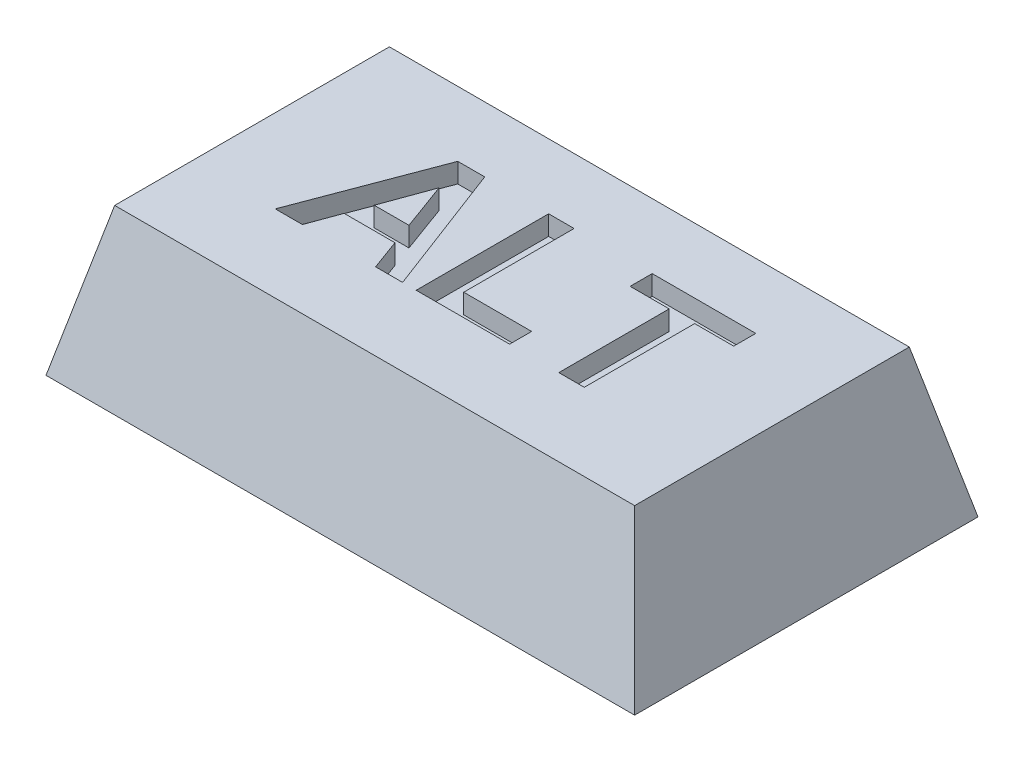
ISO-10303-21;
HEADER;
FILE_DESCRIPTION(('STEP AP214'),'2;1');
FILE_NAME('part.step','',(''),(''),'','','');
FILE_SCHEMA(('AUTOMOTIVE_DESIGN { 1 0 10303 214 1 1 1 1 }'));
ENDSEC;
DATA;
#1=APPLICATION_CONTEXT('core data for automotive mechanical design processes');
#2=APPLICATION_PROTOCOL_DEFINITION('international standard','automotive_design',2000,#1);
#3=PRODUCT_CONTEXT('',#1,'mechanical');
#4=PRODUCT('Part','Part','',(#3));
#5=PRODUCT_RELATED_PRODUCT_CATEGORY('part','',(#4));
#6=PRODUCT_DEFINITION_FORMATION('','',#4);
#7=PRODUCT_DEFINITION_CONTEXT('part definition',#1,'design');
#8=PRODUCT_DEFINITION('design','',#6,#7);
#9=PRODUCT_DEFINITION_SHAPE('','',#8);
#10=(LENGTH_UNIT() NAMED_UNIT(*) SI_UNIT(.MILLI.,.METRE.));
#11=(NAMED_UNIT(*) PLANE_ANGLE_UNIT() SI_UNIT($,.RADIAN.));
#12=(NAMED_UNIT(*) SI_UNIT($,.STERADIAN.) SOLID_ANGLE_UNIT());
#13=UNCERTAINTY_MEASURE_WITH_UNIT(LENGTH_MEASURE(1.E-05),#10,'distance_accuracy_value','');
#14=(GEOMETRIC_REPRESENTATION_CONTEXT(3) GLOBAL_UNCERTAINTY_ASSIGNED_CONTEXT((#13)) GLOBAL_UNIT_ASSIGNED_CONTEXT((#10,
#11,#12)) REPRESENTATION_CONTEXT('',''));
#15=CARTESIAN_POINT('',(0.,0.,0.));
#16=DIRECTION('',(0.,0.,1.));
#17=DIRECTION('',(1.,0.,0.));
#18=AXIS2_PLACEMENT_3D('',#15,#16,#17);
#19=CARTESIAN_POINT('',(0.,3.,0.));
#20=DIRECTION('',(0.,-1.,0.));
#21=DIRECTION('',(0.,0.,-1.));
#22=AXIS2_PLACEMENT_3D('',#19,#20,#21);
#23=PLANE('',#22);
#24=DIRECTION('',(-1.,0.,0.));
#25=VECTOR('',#24,1.);
#26=CARTESIAN_POINT('',(7.17505002507356,3.,-2.27554803448293));
#27=LINE('',#26,#25);
#28=CARTESIAN_POINT('',(7.17505002507356,3.,-2.27554803448293));
#29=VERTEX_POINT('',#28);
#30=CARTESIAN_POINT('',(5.27120387122741,3.,-2.27554803448293));
#31=VERTEX_POINT('',#30);
#32=EDGE_CURVE('E274',#29,#31,#27,.T.);
#33=ORIENTED_EDGE('',*,*,#32,.T.);
#34=DIRECTION('',(0.,0.,-1.));
#35=VECTOR('',#34,1.);
#36=CARTESIAN_POINT('',(5.27120387122741,3.,-2.27554803448293));
#37=LINE('',#36,#35);
#38=CARTESIAN_POINT('',(5.27120387122741,3.,-4.97554803448293));
#39=VERTEX_POINT('',#38);
#40=EDGE_CURVE('E400',#31,#39,#37,.T.);
#41=ORIENTED_EDGE('',*,*,#40,.T.);
#42=DIRECTION('',(1.,0.,0.));
#43=VECTOR('',#42,1.);
#44=CARTESIAN_POINT('',(5.27120387122741,3.,-4.97554803448293));
#45=LINE('',#44,#43);
#46=CARTESIAN_POINT('',(5.79043464045818,3.,-4.97554803448293));
#47=VERTEX_POINT('',#46);
#48=EDGE_CURVE('E396',#39,#47,#45,.T.);
#49=ORIENTED_EDGE('',*,*,#48,.T.);
#50=DIRECTION('',(0.,0.,1.));
#51=VECTOR('',#50,1.);
#52=CARTESIAN_POINT('',(5.79043464045818,3.,-4.97554803448293));
#53=LINE('',#52,#51);
#54=CARTESIAN_POINT('',(5.79043464045818,3.,-2.72554803448293));
#55=VERTEX_POINT('',#54);
#56=EDGE_CURVE('E392',#47,#55,#53,.T.);
#57=ORIENTED_EDGE('',*,*,#56,.T.);
#58=DIRECTION('',(1.,0.,0.));
#59=VECTOR('',#58,1.);
#60=CARTESIAN_POINT('',(5.79043464045818,3.,-2.72554803448293));
#61=LINE('',#60,#59);
#62=CARTESIAN_POINT('',(7.17505002507356,3.,-2.72554803448293));
#63=VERTEX_POINT('',#62);
#64=EDGE_CURVE('E387',#55,#63,#61,.T.);
#65=ORIENTED_EDGE('',*,*,#64,.T.);
#66=DIRECTION('',(0.,0.,1.));
#67=VECTOR('',#66,1.);
#68=CARTESIAN_POINT('',(7.17505002507356,3.,-2.72554803448293));
#69=LINE('',#68,#67);
#70=EDGE_CURVE('E383',#63,#29,#69,.T.);
#71=ORIENTED_EDGE('',*,*,#70,.T.);
#72=EDGE_LOOP('',(#33,#41,#49,#57,#65,#71));
#73=FACE_BOUND('',#72,.T.);
#74=DIRECTION('',(-1.,0.,0.));
#75=VECTOR('',#74,1.);
#76=CARTESIAN_POINT('',(12.,3.,-0.7));
#77=LINE('',#76,#75);
#78=CARTESIAN_POINT('',(11.3,3.,-0.7));
#79=VERTEX_POINT('',#78);
#80=CARTESIAN_POINT('',(0.7,3.,-0.7));
#81=VERTEX_POINT('',#80);
#82=EDGE_CURVE('E514',#79,#81,#77,.T.);
#83=ORIENTED_EDGE('',*,*,#82,.F.);
#84=DIRECTION('',(0.,0.,1.));
#85=VECTOR('',#84,1.);
#86=CARTESIAN_POINT('',(11.3,3.,-7.));
#87=LINE('',#86,#85);
#88=CARTESIAN_POINT('',(11.3,3.,-6.3));
#89=VERTEX_POINT('',#88);
#90=EDGE_CURVE('E526',#89,#79,#87,.T.);
#91=ORIENTED_EDGE('',*,*,#90,.F.);
#92=DIRECTION('',(-1.,0.,0.));
#93=VECTOR('',#92,1.);
#94=CARTESIAN_POINT('',(12.,3.,-6.3));
#95=LINE('',#94,#93);
#96=CARTESIAN_POINT('',(0.700000000000001,3.,-6.3));
#97=VERTEX_POINT('',#96);
#98=EDGE_CURVE('E510',#89,#97,#95,.T.);
#99=ORIENTED_EDGE('',*,*,#98,.T.);
#100=DIRECTION('',(0.,0.,1.));
#101=VECTOR('',#100,1.);
#102=CARTESIAN_POINT('',(0.7,3.,-7.));
#103=LINE('',#102,#101);
#104=EDGE_CURVE('E527',#97,#81,#103,.T.);
#105=ORIENTED_EDGE('',*,*,#104,.T.);
#106=EDGE_LOOP('',(#83,#91,#99,#105));
#107=FACE_BOUND('',#106,.T.);
#108=DIRECTION('',(-1.,0.,0.));
#109=VECTOR('',#108,1.);
#110=CARTESIAN_POINT('',(8.69812694815049,3.,-2.27554803448293));
#111=LINE('',#110,#109);
#112=CARTESIAN_POINT('',(8.69812694815049,3.,-2.27554803448293));
#113=VERTEX_POINT('',#112);
#114=CARTESIAN_POINT('',(8.17889617891972,3.,-2.27554803448293));
#115=VERTEX_POINT('',#114);
#116=EDGE_CURVE('E366',#113,#115,#111,.T.);
#117=ORIENTED_EDGE('',*,*,#116,.T.);
#118=DIRECTION('',(0.,0.,-1.));
#119=VECTOR('',#118,1.);
#120=CARTESIAN_POINT('',(8.17889617891972,3.,-2.27554803448293));
#121=LINE('',#120,#119);
#122=CARTESIAN_POINT('',(8.17889617891972,3.,-4.52554803448293));
#123=VERTEX_POINT('',#122);
#124=EDGE_CURVE('E476',#115,#123,#121,.T.);
#125=ORIENTED_EDGE('',*,*,#124,.T.);
#126=DIRECTION('',(-1.,0.,0.));
#127=VECTOR('',#126,1.);
#128=CARTESIAN_POINT('',(8.17889617891972,3.,-4.52554803448293));
#129=LINE('',#128,#127);
#130=CARTESIAN_POINT('',(7.38274233276587,3.,-4.52554803448293));
#131=VERTEX_POINT('',#130);
#132=EDGE_CURVE('E472',#123,#131,#129,.T.);
#133=ORIENTED_EDGE('',*,*,#132,.T.);
#134=DIRECTION('',(0.,0.,-1.));
#135=VECTOR('',#134,1.);
#136=CARTESIAN_POINT('',(7.38274233276587,3.,-4.52554803448293));
#137=LINE('',#136,#135);
#138=CARTESIAN_POINT('',(7.38274233276587,3.,-4.97554803448293));
#139=VERTEX_POINT('',#138);
#140=EDGE_CURVE('E468',#131,#139,#137,.T.);
#141=ORIENTED_EDGE('',*,*,#140,.T.);
#142=DIRECTION('',(1.,0.,0.));
#143=VECTOR('',#142,1.);
#144=CARTESIAN_POINT('',(7.38274233276587,3.,-4.97554803448293));
#145=LINE('',#144,#143);
#146=CARTESIAN_POINT('',(9.49428079430433,3.,-4.97554803448293));
#147=VERTEX_POINT('',#146);
#148=EDGE_CURVE('E464',#139,#147,#145,.T.);
#149=ORIENTED_EDGE('',*,*,#148,.T.);
#150=DIRECTION('',(0.,0.,1.));
#151=VECTOR('',#150,1.);
#152=CARTESIAN_POINT('',(9.49428079430433,3.,-4.97554803448293));
#153=LINE('',#152,#151);
#154=CARTESIAN_POINT('',(9.49428079430433,3.,-4.52554803448293));
#155=VERTEX_POINT('',#154);
#156=EDGE_CURVE('E460',#147,#155,#153,.T.);
#157=ORIENTED_EDGE('',*,*,#156,.T.);
#158=DIRECTION('',(-1.,0.,0.));
#159=VECTOR('',#158,1.);
#160=CARTESIAN_POINT('',(9.49428079430433,3.,-4.52554803448293));
#161=LINE('',#160,#159);
#162=CARTESIAN_POINT('',(8.69812694815049,3.,-4.52554803448293));
#163=VERTEX_POINT('',#162);
#164=EDGE_CURVE('E455',#155,#163,#161,.T.);
#165=ORIENTED_EDGE('',*,*,#164,.T.);
#166=DIRECTION('',(0.,0.,1.));
#167=VECTOR('',#166,1.);
#168=CARTESIAN_POINT('',(8.69812694815049,3.,-4.52554803448293));
#169=LINE('',#168,#167);
#170=EDGE_CURVE('E451',#163,#113,#169,.T.);
#171=ORIENTED_EDGE('',*,*,#170,.T.);
#172=EDGE_LOOP('',(#117,#125,#133,#141,#149,#157,#165,#171));
#173=FACE_BOUND('',#172,.T.);
#174=DIRECTION('',(0.355060662326772,0.,0.934843262835045));
#175=VECTOR('',#174,1.);
#176=CARTESIAN_POINT('',(3.96880002507356,3.,-4.97554803448293));
#177=LINE('',#176,#175);
#178=CARTESIAN_POINT('',(3.96880002507356,3.,-4.97554803448293));
#179=VERTEX_POINT('',#178);
#180=CARTESIAN_POINT('',(4.99428079430433,3.,-2.27554803448293));
#181=VERTEX_POINT('',#180);
#182=EDGE_CURVE('E62',#179,#181,#177,.T.);
#183=ORIENTED_EDGE('',*,*,#182,.T.);
#184=DIRECTION('',(-1.,0.,0.));
#185=VECTOR('',#184,1.);
#186=CARTESIAN_POINT('',(4.99428079430433,3.,-2.27554803448293));
#187=LINE('',#186,#185);
#188=CARTESIAN_POINT('',(4.44367983276587,3.,-2.27554803448293));
#189=VERTEX_POINT('',#188);
#190=EDGE_CURVE('E310',#181,#189,#187,.T.);
#191=ORIENTED_EDGE('',*,*,#190,.T.);
#192=DIRECTION('',(-0.343248282132195,0.,-0.939244705501871));
#193=VECTOR('',#192,1.);
#194=CARTESIAN_POINT('',(4.44367983276587,3.,-2.27554803448293));
#195=LINE('',#194,#193);
#196=CARTESIAN_POINT('',(4.21597550584279,3.,-2.89862495755985));
#197=VERTEX_POINT('',#196);
#198=EDGE_CURVE('E314',#189,#197,#195,.T.);
#199=ORIENTED_EDGE('',*,*,#198,.T.);
#200=DIRECTION('',(-1.,0.,0.));
#201=VECTOR('',#200,1.);
#202=CARTESIAN_POINT('',(4.21597550584279,3.,-2.89862495755985));
#203=LINE('',#202,#201);
#204=CARTESIAN_POINT('',(3.17967742891972,3.,-2.89862495755985));
#205=VERTEX_POINT('',#204);
#206=EDGE_CURVE('E318',#197,#205,#203,.T.);
#207=ORIENTED_EDGE('',*,*,#206,.T.);
#208=DIRECTION('',(-0.343248282132194,0.,0.939244705501872));
#209=VECTOR('',#208,1.);
#210=CARTESIAN_POINT('',(3.17967742891972,3.,-2.89862495755985));
#211=LINE('',#210,#209);
#212=CARTESIAN_POINT('',(2.95197310199664,3.,-2.27554803448293));
#213=VERTEX_POINT('',#212);
#214=EDGE_CURVE('E322',#205,#213,#211,.T.);
#215=ORIENTED_EDGE('',*,*,#214,.T.);
#216=DIRECTION('',(-1.,0.,0.));
#217=VECTOR('',#216,1.);
#218=CARTESIAN_POINT('',(2.95197310199664,3.,-2.27554803448293));
#219=LINE('',#218,#217);
#220=CARTESIAN_POINT('',(2.39812694815049,3.,-2.27554803448293));
#221=VERTEX_POINT('',#220);
#222=EDGE_CURVE('E326',#213,#221,#219,.T.);
#223=ORIENTED_EDGE('',*,*,#222,.T.);
#224=DIRECTION('',(0.353586403368764,0.,-0.935401868371419));
#225=VECTOR('',#224,1.);
#226=CARTESIAN_POINT('',(2.39812694815049,3.,-2.27554803448293));
#227=LINE('',#226,#225);
#228=CARTESIAN_POINT('',(3.41873992891972,3.,-4.97554803448293));
#229=VERTEX_POINT('',#228);
#230=EDGE_CURVE('E330',#221,#229,#227,.T.);
#231=ORIENTED_EDGE('',*,*,#230,.T.);
#232=DIRECTION('',(1.,0.,0.));
#233=VECTOR('',#232,1.);
#234=CARTESIAN_POINT('',(3.41873992891972,3.,-4.97554803448293));
#235=LINE('',#234,#233);
#236=EDGE_CURVE('E286',#229,#179,#235,.T.);
#237=ORIENTED_EDGE('',*,*,#236,.T.);
#238=EDGE_LOOP('',(#183,#191,#199,#207,#215,#223,#231,#237));
#239=FACE_BOUND('',#238,.T.);
#240=ADVANCED_FACE('F44',(#73,#107,#173,#239),#23,.F.);
#241=CARTESIAN_POINT('',(12.,0.,-7.));
#242=DIRECTION('',(-0.973841209741793,-0.227229615606418,0.));
#243=DIRECTION('',(0.227229615606418,-0.973841209741793,0.));
#244=AXIS2_PLACEMENT_3D('',#241,#242,#243);
#245=PLANE('',#244);
#246=DIRECTION('',(-0.221581128241521,0.949633406749378,-0.221581128241521));
#247=VECTOR('',#246,1.);
#248=CARTESIAN_POINT('',(11.6563126252505,1.47294589178357,-0.3436873747495));
#249=LINE('',#248,#247);
#250=CARTESIAN_POINT('',(12.,0.,0.));
#251=VERTEX_POINT('',#250);
#252=EDGE_CURVE('E523',#251,#79,#249,.T.);
#253=ORIENTED_EDGE('',*,*,#252,.F.);
#254=DIRECTION('',(0.,0.,-1.));
#255=VECTOR('',#254,1.);
#256=CARTESIAN_POINT('',(12.,0.,0.));
#257=LINE('',#256,#255);
#258=CARTESIAN_POINT('',(12.,0.,-7.));
#259=VERTEX_POINT('',#258);
#260=EDGE_CURVE('E535',#251,#259,#257,.T.);
#261=ORIENTED_EDGE('',*,*,#260,.T.);
#262=DIRECTION('',(0.221581128241521,-0.949633406749378,-0.221581128241521));
#263=VECTOR('',#262,1.);
#264=CARTESIAN_POINT('',(12.,0.,-7.));
#265=LINE('',#264,#263);
#266=EDGE_CURVE('E517',#89,#259,#265,.T.);
#267=ORIENTED_EDGE('',*,*,#266,.F.);
#268=ORIENTED_EDGE('',*,*,#90,.T.);
#269=EDGE_LOOP('',(#253,#261,#267,#268));
#270=FACE_BOUND('',#269,.T.);
#271=ADVANCED_FACE('F566',(#270),#245,.F.);
#272=CARTESIAN_POINT('',(0.,0.,-7.));
#273=DIRECTION('',(0.973841209741793,-0.227229615606418,0.));
#274=DIRECTION('',(0.227229615606418,0.973841209741793,0.));
#275=AXIS2_PLACEMENT_3D('',#272,#273,#274);
#276=PLANE('',#275);
#277=DIRECTION('',(-0.221581128241521,-0.949633406749378,0.221581128241521));
#278=VECTOR('',#277,1.);
#279=CARTESIAN_POINT('',(0.343687374749499,1.47294589178357,-0.3436873747495));
#280=LINE('',#279,#278);
#281=CARTESIAN_POINT('',(-6.E-06,0.,0.));
#282=VERTEX_POINT('',#281);
#283=EDGE_CURVE('E11',#81,#282,#280,.T.);
#284=ORIENTED_EDGE('',*,*,#283,.F.);
#285=ORIENTED_EDGE('',*,*,#104,.F.);
#286=DIRECTION('',(0.221581128241521,0.949633406749378,0.221581128241521));
#287=VECTOR('',#286,1.);
#288=CARTESIAN_POINT('',(0.,0.,-7.));
#289=LINE('',#288,#287);
#290=CARTESIAN_POINT('',(0.,0.,-7.));
#291=VERTEX_POINT('',#290);
#292=EDGE_CURVE('E54',#291,#97,#289,.T.);
#293=ORIENTED_EDGE('',*,*,#292,.F.);
#294=DIRECTION('',(0.,0.,1.));
#295=VECTOR('',#294,1.);
#296=CARTESIAN_POINT('',(0.,0.,0.));
#297=LINE('',#296,#295);
#298=EDGE_CURVE('E531',#291,#282,#297,.T.);
#299=ORIENTED_EDGE('',*,*,#298,.T.);
#300=EDGE_LOOP('',(#284,#285,#293,#299));
#301=FACE_BOUND('',#300,.T.);
#302=ADVANCED_FACE('F575',(#301),#276,.F.);
#303=CARTESIAN_POINT('',(0.,0.,0.));
#304=DIRECTION('',(0.,-1.,0.));
#305=DIRECTION('',(0.,0.,-1.));
#306=AXIS2_PLACEMENT_3D('',#303,#304,#305);
#307=PLANE('',#306);
#308=CARTESIAN_POINT('',(6.,0.,-3.5));
#309=DIRECTION('',(0.,-1.,0.));
#310=DIRECTION('',(0.,0.,-1.));
#311=AXIS2_PLACEMENT_3D('',#308,#309,#310);
#312=CIRCLE('',#311,1.8);
#313=CARTESIAN_POINT('',(6.,0.,-5.3));
#314=VERTEX_POINT('',#313);
#315=EDGE_CURVE('E360',#314,#314,#312,.T.);
#316=ORIENTED_EDGE('',*,*,#315,.F.);
#317=EDGE_LOOP('',(#316));
#318=FACE_BOUND('',#317,.T.);
#319=ORIENTED_EDGE('',*,*,#298,.F.);
#320=DIRECTION('',(-1.,0.,0.));
#321=VECTOR('',#320,1.);
#322=CARTESIAN_POINT('',(0.,0.,-7.));
#323=LINE('',#322,#321);
#324=EDGE_CURVE('E539',#259,#291,#323,.T.);
#325=ORIENTED_EDGE('',*,*,#324,.F.);
#326=ORIENTED_EDGE('',*,*,#260,.F.);
#327=DIRECTION('',(1.,0.,0.));
#328=VECTOR('',#327,1.);
#329=CARTESIAN_POINT('',(0.,0.,0.));
#330=LINE('',#329,#328);
#331=EDGE_CURVE('E540',#282,#251,#330,.T.);
#332=ORIENTED_EDGE('',*,*,#331,.F.);
#333=EDGE_LOOP('',(#319,#325,#326,#332));
#334=FACE_BOUND('',#333,.T.);
#335=ADVANCED_FACE('F46',(#318,#334),#307,.T.);
#336=CARTESIAN_POINT('',(12.,3.,-6.3));
#337=DIRECTION('',(0.,0.227229615606418,-0.973841209741793));
#338=DIRECTION('',(0.,0.973841209741793,0.227229615606418));
#339=AXIS2_PLACEMENT_3D('',#336,#337,#338);
#340=PLANE('',#339);
#341=ORIENTED_EDGE('',*,*,#266,.T.);
#342=ORIENTED_EDGE('',*,*,#324,.T.);
#343=ORIENTED_EDGE('',*,*,#292,.T.);
#344=ORIENTED_EDGE('',*,*,#98,.F.);
#345=EDGE_LOOP('',(#341,#342,#343,#344));
#346=FACE_BOUND('',#345,.T.);
#347=ADVANCED_FACE('F572',(#346),#340,.T.);
#348=CARTESIAN_POINT('',(12.,0.,0.));
#349=DIRECTION('',(0.,0.227229615606418,0.973841209741793));
#350=DIRECTION('',(0.,-0.973841209741793,0.227229615606418));
#351=AXIS2_PLACEMENT_3D('',#348,#349,#350);
#352=PLANE('',#351);
#353=ORIENTED_EDGE('',*,*,#252,.T.);
#354=ORIENTED_EDGE('',*,*,#82,.T.);
#355=ORIENTED_EDGE('',*,*,#283,.T.);
#356=ORIENTED_EDGE('',*,*,#331,.T.);
#357=EDGE_LOOP('',(#353,#354,#355,#356));
#358=FACE_BOUND('',#357,.T.);
#359=ADVANCED_FACE('F559',(#358),#352,.T.);
#360=CARTESIAN_POINT('',(6.,0.8,-3.5));
#361=DIRECTION('',(0.,-1.,0.));
#362=DIRECTION('',(0.,0.,-1.));
#363=AXIS2_PLACEMENT_3D('',#360,#361,#362);
#364=CYLINDRICAL_SURFACE('',#363,1.8);
#365=CARTESIAN_POINT('',(6.,0.8,-3.5));
#366=DIRECTION('',(0.,-1.,0.));
#367=DIRECTION('',(0.,0.,-1.));
#368=AXIS2_PLACEMENT_3D('',#365,#366,#367);
#369=CIRCLE('',#368,1.8);
#370=CARTESIAN_POINT('',(6.,0.8,-5.3));
#371=VERTEX_POINT('',#370);
#372=EDGE_CURVE('E506',#371,#371,#369,.T.);
#373=ORIENTED_EDGE('',*,*,#372,.F.);
#374=EDGE_LOOP('',(#373));
#375=FACE_BOUND('',#374,.T.);
#376=ORIENTED_EDGE('',*,*,#315,.T.);
#377=EDGE_LOOP('',(#376));
#378=FACE_BOUND('',#377,.T.);
#379=ADVANCED_FACE('F704',(#375,#378),#364,.F.);
#380=CARTESIAN_POINT('',(6.,0.8,-3.5));
#381=DIRECTION('',(0.,-1.,0.));
#382=DIRECTION('',(0.,0.,-1.));
#383=AXIS2_PLACEMENT_3D('',#380,#381,#382);
#384=PLANE('',#383);
#385=ORIENTED_EDGE('',*,*,#372,.T.);
#386=EDGE_LOOP('',(#385));
#387=FACE_BOUND('',#386,.T.);
#388=ADVANCED_FACE('F670',(#387),#384,.T.);
#389=CARTESIAN_POINT('',(8.69812694815049,2.6,-2.27554803448293));
#390=DIRECTION('',(0.,0.,-1.));
#391=DIRECTION('',(-1.,0.,0.));
#392=AXIS2_PLACEMENT_3D('',#389,#390,#391);
#393=PLANE('',#392);
#394=ORIENTED_EDGE('',*,*,#116,.F.);
#395=DIRECTION('',(0.,1.,0.));
#396=VECTOR('',#395,1.);
#397=CARTESIAN_POINT('',(8.69812694815049,2.6,-2.27554803448293));
#398=LINE('',#397,#396);
#399=CARTESIAN_POINT('',(8.69812694815049,2.6,-2.27554803448293));
#400=VERTEX_POINT('',#399);
#401=EDGE_CURVE('E446',#400,#113,#398,.T.);
#402=ORIENTED_EDGE('',*,*,#401,.F.);
#403=DIRECTION('',(-1.,0.,0.));
#404=VECTOR('',#403,1.);
#405=CARTESIAN_POINT('',(8.69812694815049,2.6,-2.27554803448293));
#406=LINE('',#405,#404);
#407=CARTESIAN_POINT('',(8.17889617891972,2.6,-2.27554803448293));
#408=VERTEX_POINT('',#407);
#409=EDGE_CURVE('E456',#400,#408,#406,.T.);
#410=ORIENTED_EDGE('',*,*,#409,.T.);
#411=DIRECTION('',(0.,1.,0.));
#412=VECTOR('',#411,1.);
#413=CARTESIAN_POINT('',(8.17889617891972,2.6,-2.27554803448293));
#414=LINE('',#413,#412);
#415=EDGE_CURVE('E424',#408,#115,#414,.T.);
#416=ORIENTED_EDGE('',*,*,#415,.T.);
#417=EDGE_LOOP('',(#394,#402,#410,#416));
#418=FACE_BOUND('',#417,.T.);
#419=ADVANCED_FACE('F666',(#418),#393,.T.);
#420=CARTESIAN_POINT('',(8.17889617891972,2.6,-2.27554803448293));
#421=DIRECTION('',(1.,0.,0.));
#422=DIRECTION('',(0.,0.,-1.));
#423=AXIS2_PLACEMENT_3D('',#420,#421,#422);
#424=PLANE('',#423);
#425=ORIENTED_EDGE('',*,*,#124,.F.);
#426=ORIENTED_EDGE('',*,*,#415,.F.);
#427=DIRECTION('',(0.,0.,-1.));
#428=VECTOR('',#427,1.);
#429=CARTESIAN_POINT('',(8.17889617891972,2.6,-2.27554803448293));
#430=LINE('',#429,#428);
#431=CARTESIAN_POINT('',(8.17889617891972,2.6,-4.52554803448293));
#432=VERTEX_POINT('',#431);
#433=EDGE_CURVE('E500',#408,#432,#430,.T.);
#434=ORIENTED_EDGE('',*,*,#433,.T.);
#435=DIRECTION('',(0.,1.,0.));
#436=VECTOR('',#435,1.);
#437=CARTESIAN_POINT('',(8.17889617891972,2.6,-4.52554803448293));
#438=LINE('',#437,#436);
#439=EDGE_CURVE('E428',#432,#123,#438,.T.);
#440=ORIENTED_EDGE('',*,*,#439,.T.);
#441=EDGE_LOOP('',(#425,#426,#434,#440));
#442=FACE_BOUND('',#441,.T.);
#443=ADVANCED_FACE('F669',(#442),#424,.T.);
#444=CARTESIAN_POINT('',(8.17889617891972,2.6,-4.52554803448293));
#445=DIRECTION('',(0.,0.,-1.));
#446=DIRECTION('',(-1.,0.,0.));
#447=AXIS2_PLACEMENT_3D('',#444,#445,#446);
#448=PLANE('',#447);
#449=ORIENTED_EDGE('',*,*,#132,.F.);
#450=ORIENTED_EDGE('',*,*,#439,.F.);
#451=DIRECTION('',(-1.,0.,0.));
#452=VECTOR('',#451,1.);
#453=CARTESIAN_POINT('',(8.17889617891972,2.6,-4.52554803448293));
#454=LINE('',#453,#452);
#455=CARTESIAN_POINT('',(7.38274233276587,2.6,-4.52554803448293));
#456=VERTEX_POINT('',#455);
#457=EDGE_CURVE('E497',#432,#456,#454,.T.);
#458=ORIENTED_EDGE('',*,*,#457,.T.);
#459=DIRECTION('',(0.,1.,0.));
#460=VECTOR('',#459,1.);
#461=CARTESIAN_POINT('',(7.38274233276587,2.6,-4.52554803448293));
#462=LINE('',#461,#460);
#463=EDGE_CURVE('E431',#456,#131,#462,.T.);
#464=ORIENTED_EDGE('',*,*,#463,.T.);
#465=EDGE_LOOP('',(#449,#450,#458,#464));
#466=FACE_BOUND('',#465,.T.);
#467=ADVANCED_FACE('F674',(#466),#448,.T.);
#468=CARTESIAN_POINT('',(7.38274233276587,2.6,-4.52554803448293));
#469=DIRECTION('',(1.,0.,0.));
#470=DIRECTION('',(0.,0.,-1.));
#471=AXIS2_PLACEMENT_3D('',#468,#469,#470);
#472=PLANE('',#471);
#473=ORIENTED_EDGE('',*,*,#140,.F.);
#474=ORIENTED_EDGE('',*,*,#463,.F.);
#475=DIRECTION('',(0.,0.,-1.));
#476=VECTOR('',#475,1.);
#477=CARTESIAN_POINT('',(7.38274233276587,2.6,-4.52554803448293));
#478=LINE('',#477,#476);
#479=CARTESIAN_POINT('',(7.38274233276587,2.6,-4.97554803448293));
#480=VERTEX_POINT('',#479);
#481=EDGE_CURVE('E494',#456,#480,#478,.T.);
#482=ORIENTED_EDGE('',*,*,#481,.T.);
#483=DIRECTION('',(0.,1.,0.));
#484=VECTOR('',#483,1.);
#485=CARTESIAN_POINT('',(7.38274233276587,2.6,-4.97554803448293));
#486=LINE('',#485,#484);
#487=EDGE_CURVE('E434',#480,#139,#486,.T.);
#488=ORIENTED_EDGE('',*,*,#487,.T.);
#489=EDGE_LOOP('',(#473,#474,#482,#488));
#490=FACE_BOUND('',#489,.T.);
#491=ADVANCED_FACE('F678',(#490),#472,.T.);
#492=CARTESIAN_POINT('',(7.38274233276587,2.6,-4.97554803448293));
#493=DIRECTION('',(0.,0.,1.));
#494=DIRECTION('',(1.,0.,0.));
#495=AXIS2_PLACEMENT_3D('',#492,#493,#494);
#496=PLANE('',#495);
#497=ORIENTED_EDGE('',*,*,#148,.F.);
#498=ORIENTED_EDGE('',*,*,#487,.F.);
#499=DIRECTION('',(1.,0.,0.));
#500=VECTOR('',#499,1.);
#501=CARTESIAN_POINT('',(7.38274233276587,2.6,-4.97554803448293));
#502=LINE('',#501,#500);
#503=CARTESIAN_POINT('',(9.49428079430433,2.6,-4.97554803448293));
#504=VERTEX_POINT('',#503);
#505=EDGE_CURVE('E491',#480,#504,#502,.T.);
#506=ORIENTED_EDGE('',*,*,#505,.T.);
#507=DIRECTION('',(0.,1.,0.));
#508=VECTOR('',#507,1.);
#509=CARTESIAN_POINT('',(9.49428079430433,2.6,-4.97554803448293));
#510=LINE('',#509,#508);
#511=EDGE_CURVE('E437',#504,#147,#510,.T.);
#512=ORIENTED_EDGE('',*,*,#511,.T.);
#513=EDGE_LOOP('',(#497,#498,#506,#512));
#514=FACE_BOUND('',#513,.T.);
#515=ADVANCED_FACE('F682',(#514),#496,.T.);
#516=CARTESIAN_POINT('',(9.49428079430433,2.6,-4.97554803448293));
#517=DIRECTION('',(-1.,0.,0.));
#518=DIRECTION('',(0.,0.,1.));
#519=AXIS2_PLACEMENT_3D('',#516,#517,#518);
#520=PLANE('',#519);
#521=ORIENTED_EDGE('',*,*,#156,.F.);
#522=ORIENTED_EDGE('',*,*,#511,.F.);
#523=DIRECTION('',(0.,0.,1.));
#524=VECTOR('',#523,1.);
#525=CARTESIAN_POINT('',(9.49428079430433,2.6,-4.97554803448293));
#526=LINE('',#525,#524);
#527=CARTESIAN_POINT('',(9.49428079430433,2.6,-4.52554803448293));
#528=VERTEX_POINT('',#527);
#529=EDGE_CURVE('E488',#504,#528,#526,.T.);
#530=ORIENTED_EDGE('',*,*,#529,.T.);
#531=DIRECTION('',(0.,1.,0.));
#532=VECTOR('',#531,1.);
#533=CARTESIAN_POINT('',(9.49428079430433,2.6,-4.52554803448293));
#534=LINE('',#533,#532);
#535=EDGE_CURVE('E440',#528,#155,#534,.T.);
#536=ORIENTED_EDGE('',*,*,#535,.T.);
#537=EDGE_LOOP('',(#521,#522,#530,#536));
#538=FACE_BOUND('',#537,.T.);
#539=ADVANCED_FACE('F686',(#538),#520,.T.);
#540=CARTESIAN_POINT('',(9.49428079430433,2.6,-4.52554803448293));
#541=DIRECTION('',(0.,0.,-1.));
#542=DIRECTION('',(-1.,0.,0.));
#543=AXIS2_PLACEMENT_3D('',#540,#541,#542);
#544=PLANE('',#543);
#545=ORIENTED_EDGE('',*,*,#164,.F.);
#546=ORIENTED_EDGE('',*,*,#535,.F.);
#547=DIRECTION('',(-1.,0.,0.));
#548=VECTOR('',#547,1.);
#549=CARTESIAN_POINT('',(9.49428079430433,2.6,-4.52554803448293));
#550=LINE('',#549,#548);
#551=CARTESIAN_POINT('',(8.69812694815049,2.6,-4.52554803448293));
#552=VERTEX_POINT('',#551);
#553=EDGE_CURVE('E485',#528,#552,#550,.T.);
#554=ORIENTED_EDGE('',*,*,#553,.T.);
#555=DIRECTION('',(0.,1.,0.));
#556=VECTOR('',#555,1.);
#557=CARTESIAN_POINT('',(8.69812694815049,2.6,-4.52554803448293));
#558=LINE('',#557,#556);
#559=EDGE_CURVE('E443',#552,#163,#558,.T.);
#560=ORIENTED_EDGE('',*,*,#559,.T.);
#561=EDGE_LOOP('',(#545,#546,#554,#560));
#562=FACE_BOUND('',#561,.T.);
#563=ADVANCED_FACE('F690',(#562),#544,.T.);
#564=CARTESIAN_POINT('',(8.69812694815049,2.6,-4.52554803448293));
#565=DIRECTION('',(-1.,0.,0.));
#566=DIRECTION('',(0.,0.,1.));
#567=AXIS2_PLACEMENT_3D('',#564,#565,#566);
#568=PLANE('',#567);
#569=ORIENTED_EDGE('',*,*,#170,.F.);
#570=ORIENTED_EDGE('',*,*,#559,.F.);
#571=DIRECTION('',(0.,0.,1.));
#572=VECTOR('',#571,1.);
#573=CARTESIAN_POINT('',(8.69812694815049,2.6,-4.52554803448293));
#574=LINE('',#573,#572);
#575=EDGE_CURVE('E450',#552,#400,#574,.T.);
#576=ORIENTED_EDGE('',*,*,#575,.T.);
#577=ORIENTED_EDGE('',*,*,#401,.T.);
#578=EDGE_LOOP('',(#569,#570,#576,#577));
#579=FACE_BOUND('',#578,.T.);
#580=ADVANCED_FACE('F694',(#579),#568,.T.);
#581=CARTESIAN_POINT('',(0.,2.6,0.));
#582=DIRECTION('',(0.,-1.,0.));
#583=DIRECTION('',(0.,0.,-1.));
#584=AXIS2_PLACEMENT_3D('',#581,#582,#583);
#585=PLANE('',#584);
#586=ORIENTED_EDGE('',*,*,#409,.F.);
#587=ORIENTED_EDGE('',*,*,#575,.F.);
#588=ORIENTED_EDGE('',*,*,#553,.F.);
#589=ORIENTED_EDGE('',*,*,#529,.F.);
#590=ORIENTED_EDGE('',*,*,#505,.F.);
#591=ORIENTED_EDGE('',*,*,#481,.F.);
#592=ORIENTED_EDGE('',*,*,#457,.F.);
#593=ORIENTED_EDGE('',*,*,#433,.F.);
#594=EDGE_LOOP('',(#586,#587,#588,#589,#590,#591,#592,#593));
#595=FACE_BOUND('',#594,.T.);
#596=ADVANCED_FACE('F642',(#595),#585,.F.);
#597=CARTESIAN_POINT('',(7.17505002507356,2.6,-2.27554803448293));
#598=DIRECTION('',(0.,0.,-1.));
#599=DIRECTION('',(-1.,0.,0.));
#600=AXIS2_PLACEMENT_3D('',#597,#598,#599);
#601=PLANE('',#600);
#602=ORIENTED_EDGE('',*,*,#32,.F.);
#603=DIRECTION('',(0.,1.,0.));
#604=VECTOR('',#603,1.);
#605=CARTESIAN_POINT('',(7.17505002507356,2.6,-2.27554803448293));
#606=LINE('',#605,#604);
#607=CARTESIAN_POINT('',(7.17505002507356,2.6,-2.27554803448293));
#608=VERTEX_POINT('',#607);
#609=EDGE_CURVE('E378',#608,#29,#606,.T.);
#610=ORIENTED_EDGE('',*,*,#609,.F.);
#611=DIRECTION('',(-1.,0.,0.));
#612=VECTOR('',#611,1.);
#613=CARTESIAN_POINT('',(7.17505002507356,2.6,-2.27554803448293));
#614=LINE('',#613,#612);
#615=CARTESIAN_POINT('',(5.27120387122741,2.6,-2.27554803448293));
#616=VERTEX_POINT('',#615);
#617=EDGE_CURVE('E388',#608,#616,#614,.T.);
#618=ORIENTED_EDGE('',*,*,#617,.T.);
#619=DIRECTION('',(0.,1.,0.));
#620=VECTOR('',#619,1.);
#621=CARTESIAN_POINT('',(5.27120387122741,2.6,-2.27554803448293));
#622=LINE('',#621,#620);
#623=EDGE_CURVE('E361',#616,#31,#622,.T.);
#624=ORIENTED_EDGE('',*,*,#623,.T.);
#625=EDGE_LOOP('',(#602,#610,#618,#624));
#626=FACE_BOUND('',#625,.T.);
#627=ADVANCED_FACE('F638',(#626),#601,.T.);
#628=CARTESIAN_POINT('',(5.27120387122741,2.6,-2.27554803448293));
#629=DIRECTION('',(1.,0.,0.));
#630=DIRECTION('',(0.,0.,-1.));
#631=AXIS2_PLACEMENT_3D('',#628,#629,#630);
#632=PLANE('',#631);
#633=ORIENTED_EDGE('',*,*,#40,.F.);
#634=ORIENTED_EDGE('',*,*,#623,.F.);
#635=DIRECTION('',(0.,0.,-1.));
#636=VECTOR('',#635,1.);
#637=CARTESIAN_POINT('',(5.27120387122741,2.6,-2.27554803448293));
#638=LINE('',#637,#636);
#639=CARTESIAN_POINT('',(5.27120387122741,2.6,-4.97554803448293));
#640=VERTEX_POINT('',#639);
#641=EDGE_CURVE('E418',#616,#640,#638,.T.);
#642=ORIENTED_EDGE('',*,*,#641,.T.);
#643=DIRECTION('',(0.,1.,0.));
#644=VECTOR('',#643,1.);
#645=CARTESIAN_POINT('',(5.27120387122741,2.6,-4.97554803448293));
#646=LINE('',#645,#644);
#647=EDGE_CURVE('E365',#640,#39,#646,.T.);
#648=ORIENTED_EDGE('',*,*,#647,.T.);
#649=EDGE_LOOP('',(#633,#634,#642,#648));
#650=FACE_BOUND('',#649,.T.);
#651=ADVANCED_FACE('F641',(#650),#632,.T.);
#652=CARTESIAN_POINT('',(5.27120387122741,2.6,-4.97554803448293));
#653=DIRECTION('',(0.,0.,1.));
#654=DIRECTION('',(1.,0.,0.));
#655=AXIS2_PLACEMENT_3D('',#652,#653,#654);
#656=PLANE('',#655);
#657=ORIENTED_EDGE('',*,*,#48,.F.);
#658=ORIENTED_EDGE('',*,*,#647,.F.);
#659=DIRECTION('',(1.,0.,0.));
#660=VECTOR('',#659,1.);
#661=CARTESIAN_POINT('',(5.27120387122741,2.6,-4.97554803448293));
#662=LINE('',#661,#660);
#663=CARTESIAN_POINT('',(5.79043464045818,2.6,-4.97554803448293));
#664=VERTEX_POINT('',#663);
#665=EDGE_CURVE('E415',#640,#664,#662,.T.);
#666=ORIENTED_EDGE('',*,*,#665,.T.);
#667=DIRECTION('',(0.,1.,0.));
#668=VECTOR('',#667,1.);
#669=CARTESIAN_POINT('',(5.79043464045818,2.6,-4.97554803448293));
#670=LINE('',#669,#668);
#671=EDGE_CURVE('E369',#664,#47,#670,.T.);
#672=ORIENTED_EDGE('',*,*,#671,.T.);
#673=EDGE_LOOP('',(#657,#658,#666,#672));
#674=FACE_BOUND('',#673,.T.);
#675=ADVANCED_FACE('F646',(#674),#656,.T.);
#676=CARTESIAN_POINT('',(5.79043464045818,2.6,-4.97554803448293));
#677=DIRECTION('',(-1.,0.,0.));
#678=DIRECTION('',(0.,0.,1.));
#679=AXIS2_PLACEMENT_3D('',#676,#677,#678);
#680=PLANE('',#679);
#681=ORIENTED_EDGE('',*,*,#56,.F.);
#682=ORIENTED_EDGE('',*,*,#671,.F.);
#683=DIRECTION('',(0.,0.,1.));
#684=VECTOR('',#683,1.);
#685=CARTESIAN_POINT('',(5.79043464045818,2.6,-4.97554803448293));
#686=LINE('',#685,#684);
#687=CARTESIAN_POINT('',(5.79043464045818,2.6,-2.72554803448293));
#688=VERTEX_POINT('',#687);
#689=EDGE_CURVE('E412',#664,#688,#686,.T.);
#690=ORIENTED_EDGE('',*,*,#689,.T.);
#691=DIRECTION('',(0.,1.,0.));
#692=VECTOR('',#691,1.);
#693=CARTESIAN_POINT('',(5.79043464045818,2.6,-2.72554803448293));
#694=LINE('',#693,#692);
#695=EDGE_CURVE('E372',#688,#55,#694,.T.);
#696=ORIENTED_EDGE('',*,*,#695,.T.);
#697=EDGE_LOOP('',(#681,#682,#690,#696));
#698=FACE_BOUND('',#697,.T.);
#699=ADVANCED_FACE('F650',(#698),#680,.T.);
#700=CARTESIAN_POINT('',(5.79043464045818,2.6,-2.72554803448293));
#701=DIRECTION('',(0.,0.,1.));
#702=DIRECTION('',(1.,0.,0.));
#703=AXIS2_PLACEMENT_3D('',#700,#701,#702);
#704=PLANE('',#703);
#705=ORIENTED_EDGE('',*,*,#64,.F.);
#706=ORIENTED_EDGE('',*,*,#695,.F.);
#707=DIRECTION('',(1.,0.,0.));
#708=VECTOR('',#707,1.);
#709=CARTESIAN_POINT('',(5.79043464045818,2.6,-2.72554803448293));
#710=LINE('',#709,#708);
#711=CARTESIAN_POINT('',(7.17505002507356,2.6,-2.72554803448293));
#712=VERTEX_POINT('',#711);
#713=EDGE_CURVE('E409',#688,#712,#710,.T.);
#714=ORIENTED_EDGE('',*,*,#713,.T.);
#715=DIRECTION('',(0.,1.,0.));
#716=VECTOR('',#715,1.);
#717=CARTESIAN_POINT('',(7.17505002507356,2.6,-2.72554803448293));
#718=LINE('',#717,#716);
#719=EDGE_CURVE('E375',#712,#63,#718,.T.);
#720=ORIENTED_EDGE('',*,*,#719,.T.);
#721=EDGE_LOOP('',(#705,#706,#714,#720));
#722=FACE_BOUND('',#721,.T.);
#723=ADVANCED_FACE('F654',(#722),#704,.T.);
#724=CARTESIAN_POINT('',(7.17505002507356,2.6,-2.72554803448293));
#725=DIRECTION('',(-1.,0.,0.));
#726=DIRECTION('',(0.,0.,1.));
#727=AXIS2_PLACEMENT_3D('',#724,#725,#726);
#728=PLANE('',#727);
#729=ORIENTED_EDGE('',*,*,#70,.F.);
#730=ORIENTED_EDGE('',*,*,#719,.F.);
#731=DIRECTION('',(0.,0.,1.));
#732=VECTOR('',#731,1.);
#733=CARTESIAN_POINT('',(7.17505002507356,2.6,-2.72554803448293));
#734=LINE('',#733,#732);
#735=EDGE_CURVE('E382',#712,#608,#734,.T.);
#736=ORIENTED_EDGE('',*,*,#735,.T.);
#737=ORIENTED_EDGE('',*,*,#609,.T.);
#738=EDGE_LOOP('',(#729,#730,#736,#737));
#739=FACE_BOUND('',#738,.T.);
#740=ADVANCED_FACE('F658',(#739),#728,.T.);
#741=CARTESIAN_POINT('',(0.,2.6,0.));
#742=DIRECTION('',(0.,-1.,0.));
#743=DIRECTION('',(0.,0.,-1.));
#744=AXIS2_PLACEMENT_3D('',#741,#742,#743);
#745=PLANE('',#744);
#746=ORIENTED_EDGE('',*,*,#617,.F.);
#747=ORIENTED_EDGE('',*,*,#735,.F.);
#748=ORIENTED_EDGE('',*,*,#713,.F.);
#749=ORIENTED_EDGE('',*,*,#689,.F.);
#750=ORIENTED_EDGE('',*,*,#665,.F.);
#751=ORIENTED_EDGE('',*,*,#641,.F.);
#752=EDGE_LOOP('',(#746,#747,#748,#749,#750,#751));
#753=FACE_BOUND('',#752,.T.);
#754=ADVANCED_FACE('F637',(#753),#745,.F.);
#755=CARTESIAN_POINT('',(3.96880002507356,2.6,-4.97554803448293));
#756=DIRECTION('',(-0.934843262835045,0.,0.355060662326772));
#757=DIRECTION('',(0.355060662326772,0.,0.934843262835046));
#758=AXIS2_PLACEMENT_3D('',#755,#756,#757);
#759=PLANE('',#758);
#760=ORIENTED_EDGE('',*,*,#182,.F.);
#761=DIRECTION('',(0.,1.,0.));
#762=VECTOR('',#761,1.);
#763=CARTESIAN_POINT('',(3.96880002507356,2.6,-4.97554803448293));
#764=LINE('',#763,#762);
#765=CARTESIAN_POINT('',(3.96880002507356,2.6,-4.97554803448293));
#766=VERTEX_POINT('',#765);
#767=EDGE_CURVE('E307',#766,#179,#764,.T.);
#768=ORIENTED_EDGE('',*,*,#767,.F.);
#769=DIRECTION('',(0.355060662326772,0.,0.934843262835045));
#770=VECTOR('',#769,1.);
#771=CARTESIAN_POINT('',(3.96880002507356,2.6,-4.97554803448293));
#772=LINE('',#771,#770);
#773=CARTESIAN_POINT('',(4.99428079430433,2.6,-2.27554803448293));
#774=VERTEX_POINT('',#773);
#775=EDGE_CURVE('E281',#766,#774,#772,.T.);
#776=ORIENTED_EDGE('',*,*,#775,.T.);
#777=DIRECTION('',(0.,1.,0.));
#778=VECTOR('',#777,1.);
#779=CARTESIAN_POINT('',(4.99428079430433,2.6,-2.27554803448293));
#780=LINE('',#779,#778);
#781=EDGE_CURVE('E357',#774,#181,#780,.T.);
#782=ORIENTED_EDGE('',*,*,#781,.T.);
#783=EDGE_LOOP('',(#760,#768,#776,#782));
#784=FACE_BOUND('',#783,.T.);
#785=ADVANCED_FACE('F589',(#784),#759,.T.);
#786=CARTESIAN_POINT('',(4.99428079430433,2.6,-2.27554803448293));
#787=DIRECTION('',(0.,0.,-1.));
#788=DIRECTION('',(-1.,0.,0.));
#789=AXIS2_PLACEMENT_3D('',#786,#787,#788);
#790=PLANE('',#789);
#791=ORIENTED_EDGE('',*,*,#190,.F.);
#792=ORIENTED_EDGE('',*,*,#781,.F.);
#793=DIRECTION('',(-1.,0.,0.));
#794=VECTOR('',#793,1.);
#795=CARTESIAN_POINT('',(4.99428079430433,2.6,-2.27554803448293));
#796=LINE('',#795,#794);
#797=CARTESIAN_POINT('',(4.44367983276587,2.6,-2.27554803448293));
#798=VERTEX_POINT('',#797);
#799=EDGE_CURVE('E285',#774,#798,#796,.T.);
#800=ORIENTED_EDGE('',*,*,#799,.T.);
#801=DIRECTION('',(0.,1.,0.));
#802=VECTOR('',#801,1.);
#803=CARTESIAN_POINT('',(4.44367983276587,2.6,-2.27554803448293));
#804=LINE('',#803,#802);
#805=EDGE_CURVE('E354',#798,#189,#804,.T.);
#806=ORIENTED_EDGE('',*,*,#805,.T.);
#807=EDGE_LOOP('',(#791,#792,#800,#806));
#808=FACE_BOUND('',#807,.T.);
#809=ADVANCED_FACE('F596',(#808),#790,.T.);
#810=CARTESIAN_POINT('',(4.44367983276587,2.6,-2.27554803448293));
#811=DIRECTION('',(0.939244705501871,0.,-0.343248282132195));
#812=DIRECTION('',(-0.343248282132195,0.,-0.939244705501871));
#813=AXIS2_PLACEMENT_3D('',#810,#811,#812);
#814=PLANE('',#813);
#815=ORIENTED_EDGE('',*,*,#198,.F.);
#816=ORIENTED_EDGE('',*,*,#805,.F.);
#817=DIRECTION('',(-0.343248282132195,0.,-0.939244705501871));
#818=VECTOR('',#817,1.);
#819=CARTESIAN_POINT('',(4.44367983276587,2.6,-2.27554803448293));
#820=LINE('',#819,#818);
#821=CARTESIAN_POINT('',(4.21597550584279,2.6,-2.89862495755985));
#822=VERTEX_POINT('',#821);
#823=EDGE_CURVE('E289',#798,#822,#820,.T.);
#824=ORIENTED_EDGE('',*,*,#823,.T.);
#825=DIRECTION('',(0.,1.,0.));
#826=VECTOR('',#825,1.);
#827=CARTESIAN_POINT('',(4.21597550584279,2.6,-2.89862495755985));
#828=LINE('',#827,#826);
#829=EDGE_CURVE('E351',#822,#197,#828,.T.);
#830=ORIENTED_EDGE('',*,*,#829,.T.);
#831=EDGE_LOOP('',(#815,#816,#824,#830));
#832=FACE_BOUND('',#831,.T.);
#833=ADVANCED_FACE('F599',(#832),#814,.T.);
#834=CARTESIAN_POINT('',(4.21597550584279,2.6,-2.89862495755985));
#835=DIRECTION('',(0.,0.,-1.));
#836=DIRECTION('',(-1.,0.,0.));
#837=AXIS2_PLACEMENT_3D('',#834,#835,#836);
#838=PLANE('',#837);
#839=ORIENTED_EDGE('',*,*,#206,.F.);
#840=ORIENTED_EDGE('',*,*,#829,.F.);
#841=DIRECTION('',(-1.,0.,0.));
#842=VECTOR('',#841,1.);
#843=CARTESIAN_POINT('',(4.21597550584279,2.6,-2.89862495755985));
#844=LINE('',#843,#842);
#845=CARTESIAN_POINT('',(3.17967742891972,2.6,-2.89862495755985));
#846=VERTEX_POINT('',#845);
#847=EDGE_CURVE('E292',#822,#846,#844,.T.);
#848=ORIENTED_EDGE('',*,*,#847,.T.);
#849=DIRECTION('',(0.,1.,0.));
#850=VECTOR('',#849,1.);
#851=CARTESIAN_POINT('',(3.17967742891972,2.6,-2.89862495755985));
#852=LINE('',#851,#850);
#853=EDGE_CURVE('E348',#846,#205,#852,.T.);
#854=ORIENTED_EDGE('',*,*,#853,.T.);
#855=EDGE_LOOP('',(#839,#840,#848,#854));
#856=FACE_BOUND('',#855,.T.);
#857=ADVANCED_FACE('F604',(#856),#838,.T.);
#858=CARTESIAN_POINT('',(3.17967742891972,2.6,-2.89862495755985));
#859=DIRECTION('',(-0.939244705501872,0.,-0.343248282132194));
#860=DIRECTION('',(-0.343248282132194,0.,0.939244705501872));
#861=AXIS2_PLACEMENT_3D('',#858,#859,#860);
#862=PLANE('',#861);
#863=ORIENTED_EDGE('',*,*,#214,.F.);
#864=ORIENTED_EDGE('',*,*,#853,.F.);
#865=DIRECTION('',(-0.343248282132194,0.,0.939244705501872));
#866=VECTOR('',#865,1.);
#867=CARTESIAN_POINT('',(3.17967742891972,2.6,-2.89862495755985));
#868=LINE('',#867,#866);
#869=CARTESIAN_POINT('',(2.95197310199664,2.6,-2.27554803448293));
#870=VERTEX_POINT('',#869);
#871=EDGE_CURVE('E295',#846,#870,#868,.T.);
#872=ORIENTED_EDGE('',*,*,#871,.T.);
#873=DIRECTION('',(0.,1.,0.));
#874=VECTOR('',#873,1.);
#875=CARTESIAN_POINT('',(2.95197310199664,2.6,-2.27554803448293));
#876=LINE('',#875,#874);
#877=EDGE_CURVE('E345',#870,#213,#876,.T.);
#878=ORIENTED_EDGE('',*,*,#877,.T.);
#879=EDGE_LOOP('',(#863,#864,#872,#878));
#880=FACE_BOUND('',#879,.T.);
#881=ADVANCED_FACE('F608',(#880),#862,.T.);
#882=CARTESIAN_POINT('',(2.95197310199664,2.6,-2.27554803448293));
#883=DIRECTION('',(0.,0.,-1.));
#884=DIRECTION('',(-1.,0.,0.));
#885=AXIS2_PLACEMENT_3D('',#882,#883,#884);
#886=PLANE('',#885);
#887=ORIENTED_EDGE('',*,*,#222,.F.);
#888=ORIENTED_EDGE('',*,*,#877,.F.);
#889=DIRECTION('',(-1.,0.,0.));
#890=VECTOR('',#889,1.);
#891=CARTESIAN_POINT('',(2.95197310199664,2.6,-2.27554803448293));
#892=LINE('',#891,#890);
#893=CARTESIAN_POINT('',(2.39812694815049,2.6,-2.27554803448293));
#894=VERTEX_POINT('',#893);
#895=EDGE_CURVE('E298',#870,#894,#892,.T.);
#896=ORIENTED_EDGE('',*,*,#895,.T.);
#897=DIRECTION('',(0.,1.,0.));
#898=VECTOR('',#897,1.);
#899=CARTESIAN_POINT('',(2.39812694815049,2.6,-2.27554803448293));
#900=LINE('',#899,#898);
#901=EDGE_CURVE('E342',#894,#221,#900,.T.);
#902=ORIENTED_EDGE('',*,*,#901,.T.);
#903=EDGE_LOOP('',(#887,#888,#896,#902));
#904=FACE_BOUND('',#903,.T.);
#905=ADVANCED_FACE('F613',(#904),#886,.T.);
#906=CARTESIAN_POINT('',(2.39812694815049,2.6,-2.27554803448293));
#907=DIRECTION('',(0.935401868371419,0.,0.353586403368764));
#908=DIRECTION('',(0.353586403368764,0.,-0.935401868371419));
#909=AXIS2_PLACEMENT_3D('',#906,#907,#908);
#910=PLANE('',#909);
#911=ORIENTED_EDGE('',*,*,#230,.F.);
#912=ORIENTED_EDGE('',*,*,#901,.F.);
#913=DIRECTION('',(0.353586403368764,0.,-0.935401868371419));
#914=VECTOR('',#913,1.);
#915=CARTESIAN_POINT('',(2.39812694815049,2.6,-2.27554803448293));
#916=LINE('',#915,#914);
#917=CARTESIAN_POINT('',(3.41873992891972,2.6,-4.97554803448293));
#918=VERTEX_POINT('',#917);
#919=EDGE_CURVE('E301',#894,#918,#916,.T.);
#920=ORIENTED_EDGE('',*,*,#919,.T.);
#921=DIRECTION('',(0.,1.,0.));
#922=VECTOR('',#921,1.);
#923=CARTESIAN_POINT('',(3.41873992891972,2.6,-4.97554803448293));
#924=LINE('',#923,#922);
#925=EDGE_CURVE('E339',#918,#229,#924,.T.);
#926=ORIENTED_EDGE('',*,*,#925,.T.);
#927=EDGE_LOOP('',(#911,#912,#920,#926));
#928=FACE_BOUND('',#927,.T.);
#929=ADVANCED_FACE('F616',(#928),#910,.T.);
#930=CARTESIAN_POINT('',(3.41873992891972,2.6,-4.97554803448293));
#931=DIRECTION('',(0.,0.,1.));
#932=DIRECTION('',(1.,0.,0.));
#933=AXIS2_PLACEMENT_3D('',#930,#931,#932);
#934=PLANE('',#933);
#935=ORIENTED_EDGE('',*,*,#236,.F.);
#936=ORIENTED_EDGE('',*,*,#925,.F.);
#937=DIRECTION('',(1.,0.,0.));
#938=VECTOR('',#937,1.);
#939=CARTESIAN_POINT('',(3.41873992891972,2.6,-4.97554803448293));
#940=LINE('',#939,#938);
#941=EDGE_CURVE('E304',#918,#766,#940,.T.);
#942=ORIENTED_EDGE('',*,*,#941,.T.);
#943=ORIENTED_EDGE('',*,*,#767,.T.);
#944=EDGE_LOOP('',(#935,#936,#942,#943));
#945=FACE_BOUND('',#944,.T.);
#946=ADVANCED_FACE('F586',(#945),#934,.T.);
#947=CARTESIAN_POINT('',(0.,2.6,0.));
#948=DIRECTION('',(0.,-1.,0.));
#949=DIRECTION('',(0.,0.,-1.));
#950=AXIS2_PLACEMENT_3D('',#947,#948,#949);
#951=PLANE('',#950);
#952=DIRECTION('',(1.,0.,0.));
#953=VECTOR('',#952,1.);
#954=CARTESIAN_POINT('',(3.34247790968895,2.6,-3.34862495755985));
#955=LINE('',#954,#953);
#956=CARTESIAN_POINT('',(3.34247790968895,2.6,-3.34862495755985));
#957=VERTEX_POINT('',#956);
#958=CARTESIAN_POINT('',(4.0510115635351,2.6,-3.34862495755985));
#959=VERTEX_POINT('',#958);
#960=EDGE_CURVE('E258',#957,#959,#955,.T.);
#961=ORIENTED_EDGE('',*,*,#960,.F.);
#962=DIRECTION('',(-0.342837179853215,0.,0.939394841432661));
#963=VECTOR('',#962,1.);
#964=CARTESIAN_POINT('',(3.69620387122741,2.6,-4.31785572679062));
#965=LINE('',#964,#963);
#966=CARTESIAN_POINT('',(3.69620387122741,2.6,-4.31785572679062));
#967=VERTEX_POINT('',#966);
#968=EDGE_CURVE('E252',#967,#957,#965,.T.);
#969=ORIENTED_EDGE('',*,*,#968,.F.);
#970=DIRECTION('',(-0.343761882683261,0.,-0.939056850256714));
#971=VECTOR('',#970,1.);
#972=CARTESIAN_POINT('',(4.0510115635351,2.6,-3.34862495755985));
#973=LINE('',#972,#971);
#974=EDGE_CURVE('E243',#959,#967,#973,.T.);
#975=ORIENTED_EDGE('',*,*,#974,.F.);
#976=EDGE_LOOP('',(#961,#969,#975));
#977=FACE_BOUND('',#976,.T.);
#978=ORIENTED_EDGE('',*,*,#775,.F.);
#979=ORIENTED_EDGE('',*,*,#941,.F.);
#980=ORIENTED_EDGE('',*,*,#919,.F.);
#981=ORIENTED_EDGE('',*,*,#895,.F.);
#982=ORIENTED_EDGE('',*,*,#871,.F.);
#983=ORIENTED_EDGE('',*,*,#847,.F.);
#984=ORIENTED_EDGE('',*,*,#823,.F.);
#985=ORIENTED_EDGE('',*,*,#799,.F.);
#986=EDGE_LOOP('',(#978,#979,#980,#981,#982,#983,#984,#985));
#987=FACE_BOUND('',#986,.T.);
#988=ADVANCED_FACE('F256',(#977,#987),#951,.F.);
#989=CARTESIAN_POINT('',(3.34247790968895,2.6,-3.34862495755985));
#990=DIRECTION('',(0.,0.,1.));
#991=DIRECTION('',(1.,0.,0.));
#992=AXIS2_PLACEMENT_3D('',#989,#990,#991);
#993=PLANE('',#992);
#994=DIRECTION('',(1.,0.,0.));
#995=VECTOR('',#994,1.);
#996=CARTESIAN_POINT('',(3.34247790968895,3.,-3.34862495755985));
#997=LINE('',#996,#995);
#998=CARTESIAN_POINT('',(3.34247790968895,3.,-3.34862495755985));
#999=VERTEX_POINT('',#998);
#1000=CARTESIAN_POINT('',(4.0510115635351,3.,-3.34862495755985));
#1001=VERTEX_POINT('',#1000);
#1002=EDGE_CURVE('E271',#999,#1001,#997,.T.);
#1003=ORIENTED_EDGE('',*,*,#1002,.F.);
#1004=DIRECTION('',(0.,1.,0.));
#1005=VECTOR('',#1004,1.);
#1006=CARTESIAN_POINT('',(3.34247790968895,2.6,-3.34862495755985));
#1007=LINE('',#1006,#1005);
#1008=EDGE_CURVE('E263',#957,#999,#1007,.T.);
#1009=ORIENTED_EDGE('',*,*,#1008,.F.);
#1010=ORIENTED_EDGE('',*,*,#960,.T.);
#1011=DIRECTION('',(0.,1.,0.));
#1012=VECTOR('',#1011,1.);
#1013=CARTESIAN_POINT('',(4.0510115635351,2.6,-3.34862495755985));
#1014=LINE('',#1013,#1012);
#1015=EDGE_CURVE('E240',#959,#1001,#1014,.T.);
#1016=ORIENTED_EDGE('',*,*,#1015,.T.);
#1017=EDGE_LOOP('',(#1003,#1009,#1010,#1016));
#1018=FACE_BOUND('',#1017,.T.);
#1019=ADVANCED_FACE('F262',(#1018),#993,.T.);
#1020=CARTESIAN_POINT('',(3.69620387122741,2.6,-4.31785572679062));
#1021=DIRECTION('',(-0.939394841432661,0.,-0.342837179853215));
#1022=DIRECTION('',(-0.342837179853215,0.,0.939394841432661));
#1023=AXIS2_PLACEMENT_3D('',#1020,#1021,#1022);
#1024=PLANE('',#1023);
#1025=DIRECTION('',(-0.342837179853215,0.,0.939394841432661));
#1026=VECTOR('',#1025,1.);
#1027=CARTESIAN_POINT('',(3.69620387122741,3.,-4.31785572679062));
#1028=LINE('',#1027,#1026);
#1029=CARTESIAN_POINT('',(3.69620387122741,3.,-4.31785572679062));
#1030=VERTEX_POINT('',#1029);
#1031=EDGE_CURVE('E70',#1030,#999,#1028,.T.);
#1032=ORIENTED_EDGE('',*,*,#1031,.F.);
#1033=DIRECTION('',(0.,1.,0.));
#1034=VECTOR('',#1033,1.);
#1035=CARTESIAN_POINT('',(3.69620387122741,2.6,-4.31785572679062));
#1036=LINE('',#1035,#1034);
#1037=EDGE_CURVE('E251',#967,#1030,#1036,.T.);
#1038=ORIENTED_EDGE('',*,*,#1037,.F.);
#1039=ORIENTED_EDGE('',*,*,#968,.T.);
#1040=ORIENTED_EDGE('',*,*,#1008,.T.);
#1041=EDGE_LOOP('',(#1032,#1038,#1039,#1040));
#1042=FACE_BOUND('',#1041,.T.);
#1043=ADVANCED_FACE('F864',(#1042),#1024,.T.);
#1044=CARTESIAN_POINT('',(4.0510115635351,2.6,-3.34862495755985));
#1045=DIRECTION('',(0.939056850256714,0.,-0.343761882683261));
#1046=DIRECTION('',(-0.343761882683261,0.,-0.939056850256714));
#1047=AXIS2_PLACEMENT_3D('',#1044,#1045,#1046);
#1048=PLANE('',#1047);
#1049=DIRECTION('',(-0.343761882683261,0.,-0.939056850256714));
#1050=VECTOR('',#1049,1.);
#1051=CARTESIAN_POINT('',(4.0510115635351,3.,-3.34862495755985));
#1052=LINE('',#1051,#1050);
#1053=EDGE_CURVE('E245',#1001,#1030,#1052,.T.);
#1054=ORIENTED_EDGE('',*,*,#1053,.F.);
#1055=ORIENTED_EDGE('',*,*,#1015,.F.);
#1056=ORIENTED_EDGE('',*,*,#974,.T.);
#1057=ORIENTED_EDGE('',*,*,#1037,.T.);
#1058=EDGE_LOOP('',(#1054,#1055,#1056,#1057));
#1059=FACE_BOUND('',#1058,.T.);
#1060=ADVANCED_FACE('F242',(#1059),#1048,.T.);
#1061=ORIENTED_EDGE('',*,*,#1002,.T.);
#1062=ORIENTED_EDGE('',*,*,#1053,.T.);
#1063=ORIENTED_EDGE('',*,*,#1031,.T.);
#1064=EDGE_LOOP('',(#1061,#1062,#1063));
#1065=FACE_BOUND('',#1064,.T.);
#1066=ADVANCED_FACE('F580',(#1065),#23,.F.);
#1067=CLOSED_SHELL('',(#240,#271,#302,#335,#347,#359,#379,#388,#419,#443,#467,#491,#515,#539,
#563,#580,#596,#627,#651,#675,#699,#723,#740,#754,#785,#809,#833,#857,#881,#905,#929,#946,#988,
#1019,#1043,#1060,#1066));
#1068=MANIFOLD_SOLID_BREP('B2',#1067);
#1069=ADVANCED_BREP_SHAPE_REPRESENTATION('',(#18,#1068),#14);
#1070=SHAPE_DEFINITION_REPRESENTATION(#9,#1069);
ENDSEC;
END-ISO-10303-21;
